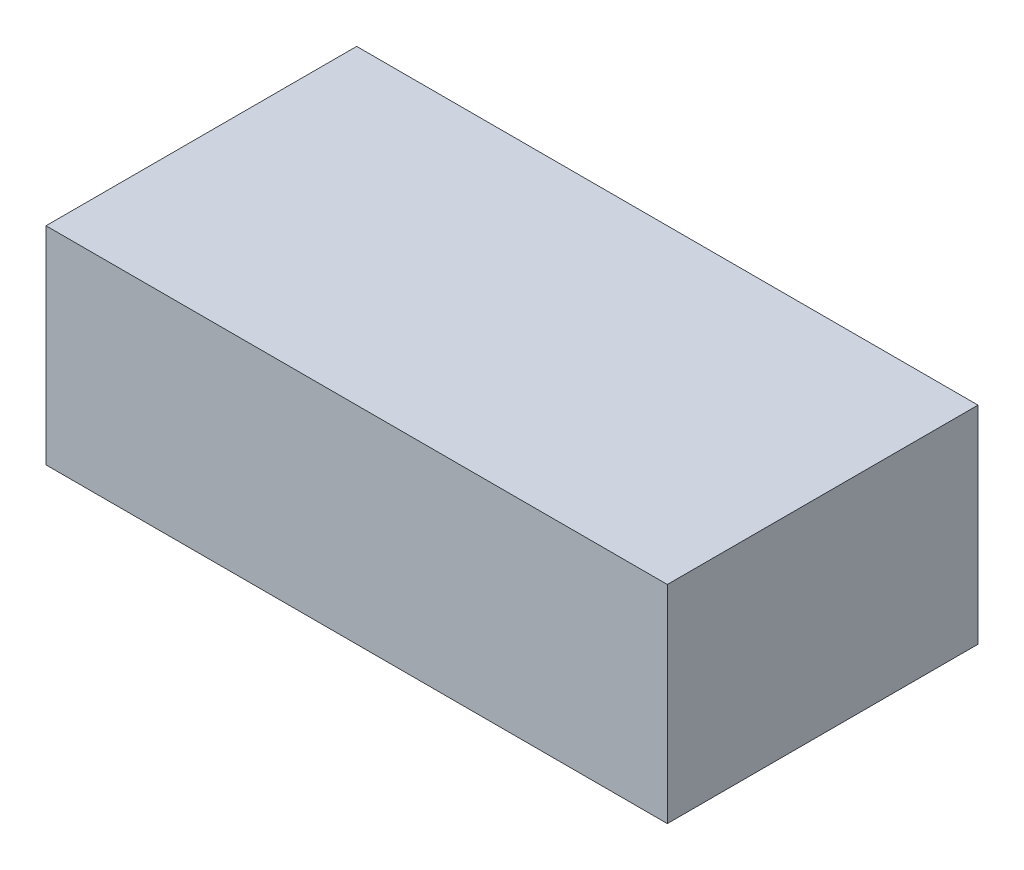
ISO-10303-21;
HEADER;
FILE_DESCRIPTION(('STEP AP214'),'2;1');
FILE_NAME('part.step','',(''),(''),'','','');
FILE_SCHEMA(('AUTOMOTIVE_DESIGN { 1 0 10303 214 1 1 1 1 }'));
ENDSEC;
DATA;
#1=APPLICATION_CONTEXT('core data for automotive mechanical design processes');
#2=APPLICATION_PROTOCOL_DEFINITION('international standard','automotive_design',2000,#1);
#3=PRODUCT_CONTEXT('',#1,'mechanical');
#4=PRODUCT('Part','Part','',(#3));
#5=PRODUCT_RELATED_PRODUCT_CATEGORY('part','',(#4));
#6=PRODUCT_DEFINITION_FORMATION('','',#4);
#7=PRODUCT_DEFINITION_CONTEXT('part definition',#1,'design');
#8=PRODUCT_DEFINITION('design','',#6,#7);
#9=PRODUCT_DEFINITION_SHAPE('','',#8);
#10=(LENGTH_UNIT() NAMED_UNIT(*) SI_UNIT(.MILLI.,.METRE.));
#11=(NAMED_UNIT(*) PLANE_ANGLE_UNIT() SI_UNIT($,.RADIAN.));
#12=(NAMED_UNIT(*) SI_UNIT($,.STERADIAN.) SOLID_ANGLE_UNIT());
#13=UNCERTAINTY_MEASURE_WITH_UNIT(LENGTH_MEASURE(1.E-05),#10,'distance_accuracy_value','');
#14=(GEOMETRIC_REPRESENTATION_CONTEXT(3) GLOBAL_UNCERTAINTY_ASSIGNED_CONTEXT((#13)) GLOBAL_UNIT_ASSIGNED_CONTEXT((#10,
#11,#12)) REPRESENTATION_CONTEXT('',''));
#15=CARTESIAN_POINT('',(0.,0.,0.));
#16=DIRECTION('',(0.,0.,1.));
#17=DIRECTION('',(1.,0.,0.));
#18=AXIS2_PLACEMENT_3D('',#15,#16,#17);
#19=CARTESIAN_POINT('',(9.525,6.35,4.7625));
#20=DIRECTION('',(-1.,0.,0.));
#21=DIRECTION('',(0.,0.,1.));
#22=AXIS2_PLACEMENT_3D('',#19,#20,#21);
#23=PLANE('',#22);
#24=DIRECTION('',(0.,0.,-1.));
#25=VECTOR('',#24,1.);
#26=CARTESIAN_POINT('',(9.525,0.,4.7625));
#27=LINE('',#26,#25);
#28=CARTESIAN_POINT('',(9.525,0.,4.7625));
#29=VERTEX_POINT('',#28);
#30=CARTESIAN_POINT('',(9.525,0.,-4.7625));
#31=VERTEX_POINT('',#30);
#32=EDGE_CURVE('E107',#29,#31,#27,.T.);
#33=ORIENTED_EDGE('',*,*,#32,.T.);
#34=DIRECTION('',(0.,-1.,0.));
#35=VECTOR('',#34,1.);
#36=CARTESIAN_POINT('',(9.525,6.35,-4.7625));
#37=LINE('',#36,#35);
#38=CARTESIAN_POINT('',(9.525,6.35,-4.7625));
#39=VERTEX_POINT('',#38);
#40=EDGE_CURVE('E11',#39,#31,#37,.T.);
#41=ORIENTED_EDGE('',*,*,#40,.F.);
#42=DIRECTION('',(0.,0.,-1.));
#43=VECTOR('',#42,1.);
#44=CARTESIAN_POINT('',(9.525,6.35,4.7625));
#45=LINE('',#44,#43);
#46=CARTESIAN_POINT('',(9.525,6.35,4.7625));
#47=VERTEX_POINT('',#46);
#48=EDGE_CURVE('E91',#47,#39,#45,.T.);
#49=ORIENTED_EDGE('',*,*,#48,.F.);
#50=DIRECTION('',(0.,-1.,0.));
#51=VECTOR('',#50,1.);
#52=CARTESIAN_POINT('',(9.525,6.35,4.7625));
#53=LINE('',#52,#51);
#54=EDGE_CURVE('E103',#47,#29,#53,.T.);
#55=ORIENTED_EDGE('',*,*,#54,.T.);
#56=EDGE_LOOP('',(#33,#41,#49,#55));
#57=FACE_BOUND('',#56,.T.);
#58=ADVANCED_FACE('F39',(#57),#23,.F.);
#59=CARTESIAN_POINT('',(-9.525,6.35,-4.7625));
#60=DIRECTION('',(0.,0.,1.));
#61=DIRECTION('',(1.,0.,0.));
#62=AXIS2_PLACEMENT_3D('',#59,#60,#61);
#63=PLANE('',#62);
#64=DIRECTION('',(-1.,0.,0.));
#65=VECTOR('',#64,1.);
#66=CARTESIAN_POINT('',(-9.525,0.,-4.7625));
#67=LINE('',#66,#65);
#68=CARTESIAN_POINT('',(-9.525,0.,-4.7625));
#69=VERTEX_POINT('',#68);
#70=EDGE_CURVE('E96',#31,#69,#67,.T.);
#71=ORIENTED_EDGE('',*,*,#70,.T.);
#72=DIRECTION('',(0.,-1.,0.));
#73=VECTOR('',#72,1.);
#74=CARTESIAN_POINT('',(-9.525,6.35,-4.7625));
#75=LINE('',#74,#73);
#76=CARTESIAN_POINT('',(-9.525,6.35,-4.7625));
#77=VERTEX_POINT('',#76);
#78=EDGE_CURVE('E48',#77,#69,#75,.T.);
#79=ORIENTED_EDGE('',*,*,#78,.F.);
#80=DIRECTION('',(-1.,0.,0.));
#81=VECTOR('',#80,1.);
#82=CARTESIAN_POINT('',(-9.525,6.35,-4.7625));
#83=LINE('',#82,#81);
#84=EDGE_CURVE('E86',#39,#77,#83,.T.);
#85=ORIENTED_EDGE('',*,*,#84,.F.);
#86=ORIENTED_EDGE('',*,*,#40,.T.);
#87=EDGE_LOOP('',(#71,#79,#85,#86));
#88=FACE_BOUND('',#87,.T.);
#89=ADVANCED_FACE('F95',(#88),#63,.F.);
#90=CARTESIAN_POINT('',(-9.525,6.35,4.7625));
#91=DIRECTION('',(1.,0.,0.));
#92=DIRECTION('',(0.,0.,-1.));
#93=AXIS2_PLACEMENT_3D('',#90,#91,#92);
#94=PLANE('',#93);
#95=DIRECTION('',(0.,0.,1.));
#96=VECTOR('',#95,1.);
#97=CARTESIAN_POINT('',(-9.525,0.,4.7625));
#98=LINE('',#97,#96);
#99=CARTESIAN_POINT('',(-9.525,0.,4.7625));
#100=VERTEX_POINT('',#99);
#101=EDGE_CURVE('E73',#69,#100,#98,.T.);
#102=ORIENTED_EDGE('',*,*,#101,.T.);
#103=DIRECTION('',(0.,-1.,0.));
#104=VECTOR('',#103,1.);
#105=CARTESIAN_POINT('',(-9.525,6.35,4.7625));
#106=LINE('',#105,#104);
#107=CARTESIAN_POINT('',(-9.525,6.35,4.7625));
#108=VERTEX_POINT('',#107);
#109=EDGE_CURVE('E98',#108,#100,#106,.T.);
#110=ORIENTED_EDGE('',*,*,#109,.F.);
#111=DIRECTION('',(0.,0.,1.));
#112=VECTOR('',#111,1.);
#113=CARTESIAN_POINT('',(-9.525,6.35,4.7625));
#114=LINE('',#113,#112);
#115=EDGE_CURVE('E89',#77,#108,#114,.T.);
#116=ORIENTED_EDGE('',*,*,#115,.F.);
#117=ORIENTED_EDGE('',*,*,#78,.T.);
#118=EDGE_LOOP('',(#102,#110,#116,#117));
#119=FACE_BOUND('',#118,.T.);
#120=ADVANCED_FACE('F99',(#119),#94,.F.);
#121=CARTESIAN_POINT('',(-9.525,6.35,4.7625));
#122=DIRECTION('',(0.,0.,-1.));
#123=DIRECTION('',(-1.,0.,0.));
#124=AXIS2_PLACEMENT_3D('',#121,#122,#123);
#125=PLANE('',#124);
#126=DIRECTION('',(1.,0.,0.));
#127=VECTOR('',#126,1.);
#128=CARTESIAN_POINT('',(-9.525,0.,4.7625));
#129=LINE('',#128,#127);
#130=EDGE_CURVE('E79',#100,#29,#129,.T.);
#131=ORIENTED_EDGE('',*,*,#130,.T.);
#132=ORIENTED_EDGE('',*,*,#54,.F.);
#133=DIRECTION('',(1.,0.,0.));
#134=VECTOR('',#133,1.);
#135=CARTESIAN_POINT('',(-9.525,6.35,4.7625));
#136=LINE('',#135,#134);
#137=EDGE_CURVE('E56',#108,#47,#136,.T.);
#138=ORIENTED_EDGE('',*,*,#137,.F.);
#139=ORIENTED_EDGE('',*,*,#109,.T.);
#140=EDGE_LOOP('',(#131,#132,#138,#139));
#141=FACE_BOUND('',#140,.T.);
#142=ADVANCED_FACE('F120',(#141),#125,.F.);
#143=CARTESIAN_POINT('',(0.,6.35,0.));
#144=DIRECTION('',(0.,-1.,0.));
#145=DIRECTION('',(0.,0.,-1.));
#146=AXIS2_PLACEMENT_3D('',#143,#144,#145);
#147=PLANE('',#146);
#148=ORIENTED_EDGE('',*,*,#48,.T.);
#149=ORIENTED_EDGE('',*,*,#84,.T.);
#150=ORIENTED_EDGE('',*,*,#115,.T.);
#151=ORIENTED_EDGE('',*,*,#137,.T.);
#152=EDGE_LOOP('',(#148,#149,#150,#151));
#153=FACE_BOUND('',#152,.T.);
#154=ADVANCED_FACE('F87',(#153),#147,.F.);
#155=CARTESIAN_POINT('',(0.,0.,0.));
#156=DIRECTION('',(0.,-1.,0.));
#157=DIRECTION('',(0.,0.,-1.));
#158=AXIS2_PLACEMENT_3D('',#155,#156,#157);
#159=PLANE('',#158);
#160=ORIENTED_EDGE('',*,*,#32,.F.);
#161=ORIENTED_EDGE('',*,*,#130,.F.);
#162=ORIENTED_EDGE('',*,*,#101,.F.);
#163=ORIENTED_EDGE('',*,*,#70,.F.);
#164=EDGE_LOOP('',(#160,#161,#162,#163));
#165=FACE_BOUND('',#164,.T.);
#166=ADVANCED_FACE('F123',(#165),#159,.T.);
#167=CLOSED_SHELL('',(#58,#89,#120,#142,#154,#166));
#168=MANIFOLD_SOLID_BREP('B2',#167);
#169=ADVANCED_BREP_SHAPE_REPRESENTATION('',(#18,#168),#14);
#170=SHAPE_DEFINITION_REPRESENTATION(#9,#169);
ENDSEC;
END-ISO-10303-21;
